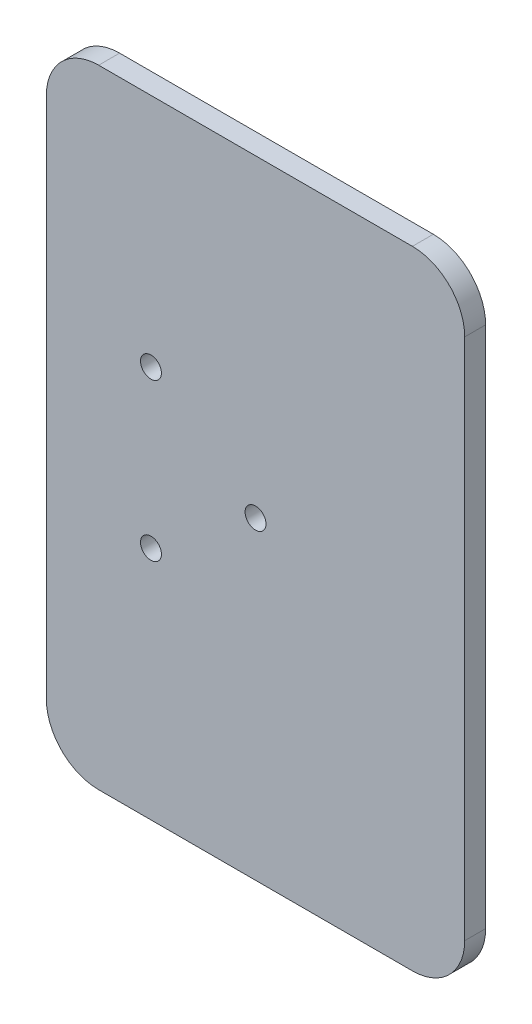
ISO-10303-21;
HEADER;
FILE_DESCRIPTION(('STEP AP214'),'2;1');
FILE_NAME('part.step','',(''),(''),'','','');
FILE_SCHEMA(('AUTOMOTIVE_DESIGN { 1 0 10303 214 1 1 1 1 }'));
ENDSEC;
DATA;
#1=APPLICATION_CONTEXT('core data for automotive mechanical design processes');
#2=APPLICATION_PROTOCOL_DEFINITION('international standard','automotive_design',2000,#1);
#3=PRODUCT_CONTEXT('',#1,'mechanical');
#4=PRODUCT('Part','Part','',(#3));
#5=PRODUCT_RELATED_PRODUCT_CATEGORY('part','',(#4));
#6=PRODUCT_DEFINITION_FORMATION('','',#4);
#7=PRODUCT_DEFINITION_CONTEXT('part definition',#1,'design');
#8=PRODUCT_DEFINITION('design','',#6,#7);
#9=PRODUCT_DEFINITION_SHAPE('','',#8);
#10=(LENGTH_UNIT() NAMED_UNIT(*) SI_UNIT(.MILLI.,.METRE.));
#11=(NAMED_UNIT(*) PLANE_ANGLE_UNIT() SI_UNIT($,.RADIAN.));
#12=(NAMED_UNIT(*) SI_UNIT($,.STERADIAN.) SOLID_ANGLE_UNIT());
#13=UNCERTAINTY_MEASURE_WITH_UNIT(LENGTH_MEASURE(1.E-05),#10,'distance_accuracy_value','');
#14=(GEOMETRIC_REPRESENTATION_CONTEXT(3) GLOBAL_UNCERTAINTY_ASSIGNED_CONTEXT((#13)) GLOBAL_UNIT_ASSIGNED_CONTEXT((#10,
#11,#12)) REPRESENTATION_CONTEXT('',''));
#15=CARTESIAN_POINT('',(0.,0.,0.));
#16=DIRECTION('',(0.,0.,1.));
#17=DIRECTION('',(1.,0.,0.));
#18=AXIS2_PLACEMENT_3D('',#15,#16,#17);
#19=CARTESIAN_POINT('',(-65.9850692997892,26.8064344030394,-2.));
#20=DIRECTION('',(0.,-1.,0.));
#21=DIRECTION('',(0.,0.,-1.));
#22=AXIS2_PLACEMENT_3D('',#19,#20,#21);
#23=PLANE('',#22);
#24=DIRECTION('',(1.,0.,0.));
#25=VECTOR('',#24,1.);
#26=CARTESIAN_POINT('',(-65.9850692997892,26.8064344030394,0.));
#27=LINE('',#26,#25);
#28=CARTESIAN_POINT('',(-60.9850692997892,26.8064344030394,0.));
#29=VERTEX_POINT('',#28);
#30=CARTESIAN_POINT('',(-30.9850692997892,26.8064344030394,0.));
#31=VERTEX_POINT('',#30);
#32=EDGE_CURVE('E148',#29,#31,#27,.T.);
#33=ORIENTED_EDGE('',*,*,#32,.T.);
#34=DIRECTION('',(0.,0.,1.));
#35=VECTOR('',#34,1.);
#36=CARTESIAN_POINT('',(-30.9850692997892,26.8064344030394,-2.));
#37=LINE('',#36,#35);
#38=CARTESIAN_POINT('',(-30.9850692997892,26.8064344030394,-2.));
#39=VERTEX_POINT('',#38);
#40=EDGE_CURVE('E123',#31,#39,#37,.F.);
#41=ORIENTED_EDGE('',*,*,#40,.T.);
#42=DIRECTION('',(1.,0.,0.));
#43=VECTOR('',#42,1.);
#44=CARTESIAN_POINT('',(-65.9850692997892,26.8064344030394,-2.));
#45=LINE('',#44,#43);
#46=CARTESIAN_POINT('',(-60.9850692997892,26.8064344030394,-2.));
#47=VERTEX_POINT('',#46);
#48=EDGE_CURVE('E161',#47,#39,#45,.T.);
#49=ORIENTED_EDGE('',*,*,#48,.F.);
#50=DIRECTION('',(0.,0.,1.));
#51=VECTOR('',#50,1.);
#52=CARTESIAN_POINT('',(-60.9850692997892,26.8064344030394,0.));
#53=LINE('',#52,#51);
#54=EDGE_CURVE('E129',#47,#29,#53,.T.);
#55=ORIENTED_EDGE('',*,*,#54,.T.);
#56=EDGE_LOOP('',(#33,#41,#49,#55));
#57=FACE_BOUND('',#56,.T.);
#58=ADVANCED_FACE('F49',(#57),#23,.F.);
#59=CARTESIAN_POINT('',(-25.9850692997892,26.8064344030394,-2.));
#60=DIRECTION('',(-1.,0.,0.));
#61=DIRECTION('',(0.,-1.,0.));
#62=AXIS2_PLACEMENT_3D('',#59,#60,#61);
#63=PLANE('',#62);
#64=DIRECTION('',(0.,-1.,0.));
#65=VECTOR('',#64,1.);
#66=CARTESIAN_POINT('',(-25.9850692997892,26.8064344030394,-2.));
#67=LINE('',#66,#65);
#68=CARTESIAN_POINT('',(-25.9850692997892,21.8064344030394,-2.));
#69=VERTEX_POINT('',#68);
#70=CARTESIAN_POINT('',(-25.9850692997892,-28.1935655969606,-2.));
#71=VERTEX_POINT('',#70);
#72=EDGE_CURVE('E139',#69,#71,#67,.T.);
#73=ORIENTED_EDGE('',*,*,#72,.F.);
#74=DIRECTION('',(0.,0.,1.));
#75=VECTOR('',#74,1.);
#76=CARTESIAN_POINT('',(-25.9850692997892,21.8064344030394,-2.));
#77=LINE('',#76,#75);
#78=CARTESIAN_POINT('',(-25.9850692997892,21.8064344030394,0.));
#79=VERTEX_POINT('',#78);
#80=EDGE_CURVE('E122',#69,#79,#77,.T.);
#81=ORIENTED_EDGE('',*,*,#80,.T.);
#82=DIRECTION('',(0.,-1.,0.));
#83=VECTOR('',#82,1.);
#84=CARTESIAN_POINT('',(-25.9850692997892,26.8064344030394,0.));
#85=LINE('',#84,#83);
#86=CARTESIAN_POINT('',(-25.9850692997892,-28.1935655969606,0.));
#87=VERTEX_POINT('',#86);
#88=EDGE_CURVE('E136',#79,#87,#85,.T.);
#89=ORIENTED_EDGE('',*,*,#88,.T.);
#90=DIRECTION('',(0.,0.,1.));
#91=VECTOR('',#90,1.);
#92=CARTESIAN_POINT('',(-25.9850692997892,-28.1935655969606,-2.));
#93=LINE('',#92,#91);
#94=EDGE_CURVE('E142',#87,#71,#93,.F.);
#95=ORIENTED_EDGE('',*,*,#94,.T.);
#96=EDGE_LOOP('',(#73,#81,#89,#95));
#97=FACE_BOUND('',#96,.T.);
#98=ADVANCED_FACE('F135',(#97),#63,.F.);
#99=CARTESIAN_POINT('',(-65.9850692997892,-33.1935655969606,-2.));
#100=DIRECTION('',(0.,-1.,0.));
#101=DIRECTION('',(0.,0.,-1.));
#102=AXIS2_PLACEMENT_3D('',#99,#100,#101);
#103=PLANE('',#102);
#104=DIRECTION('',(1.,0.,0.));
#105=VECTOR('',#104,1.);
#106=CARTESIAN_POINT('',(-65.9850692997892,-33.1935655969606,-2.));
#107=LINE('',#106,#105);
#108=CARTESIAN_POINT('',(-60.9850692997892,-33.1935655969606,-2.));
#109=VERTEX_POINT('',#108);
#110=CARTESIAN_POINT('',(-30.9850692997892,-33.1935655969606,-2.));
#111=VERTEX_POINT('',#110);
#112=EDGE_CURVE('E226',#109,#111,#107,.T.);
#113=ORIENTED_EDGE('',*,*,#112,.T.);
#114=DIRECTION('',(0.,0.,1.));
#115=VECTOR('',#114,1.);
#116=CARTESIAN_POINT('',(-30.9850692997892,-33.1935655969606,0.));
#117=LINE('',#116,#115);
#118=CARTESIAN_POINT('',(-30.9850692997892,-33.1935655969606,0.));
#119=VERTEX_POINT('',#118);
#120=EDGE_CURVE('E191',#111,#119,#117,.T.);
#121=ORIENTED_EDGE('',*,*,#120,.T.);
#122=DIRECTION('',(1.,0.,0.));
#123=VECTOR('',#122,1.);
#124=CARTESIAN_POINT('',(-65.9850692997892,-33.1935655969606,0.));
#125=LINE('',#124,#123);
#126=CARTESIAN_POINT('',(-60.9850692997892,-33.1935655969606,0.));
#127=VERTEX_POINT('',#126);
#128=EDGE_CURVE('E147',#127,#119,#125,.T.);
#129=ORIENTED_EDGE('',*,*,#128,.F.);
#130=DIRECTION('',(0.,0.,1.));
#131=VECTOR('',#130,1.);
#132=CARTESIAN_POINT('',(-60.9850692997892,-33.1935655969606,-2.));
#133=LINE('',#132,#131);
#134=EDGE_CURVE('E188',#127,#109,#133,.F.);
#135=ORIENTED_EDGE('',*,*,#134,.T.);
#136=EDGE_LOOP('',(#113,#121,#129,#135));
#137=FACE_BOUND('',#136,.T.);
#138=ADVANCED_FACE('F238',(#137),#103,.T.);
#139=CARTESIAN_POINT('',(-65.9850692997892,26.8064344030394,-2.));
#140=DIRECTION('',(-1.,0.,0.));
#141=DIRECTION('',(0.,-1.,0.));
#142=AXIS2_PLACEMENT_3D('',#139,#140,#141);
#143=PLANE('',#142);
#144=DIRECTION('',(0.,-1.,0.));
#145=VECTOR('',#144,1.);
#146=CARTESIAN_POINT('',(-65.9850692997892,26.8064344030394,-2.));
#147=LINE('',#146,#145);
#148=CARTESIAN_POINT('',(-65.9850692997892,21.8064344030394,-2.));
#149=VERTEX_POINT('',#148);
#150=CARTESIAN_POINT('',(-65.9850692997892,-28.1935655969606,-2.));
#151=VERTEX_POINT('',#150);
#152=EDGE_CURVE('E163',#149,#151,#147,.T.);
#153=ORIENTED_EDGE('',*,*,#152,.T.);
#154=DIRECTION('',(0.,0.,1.));
#155=VECTOR('',#154,1.);
#156=CARTESIAN_POINT('',(-65.9850692997892,-28.1935655969606,-2.));
#157=LINE('',#156,#155);
#158=CARTESIAN_POINT('',(-65.9850692997892,-28.1935655969606,0.));
#159=VERTEX_POINT('',#158);
#160=EDGE_CURVE('E11',#151,#159,#157,.T.);
#161=ORIENTED_EDGE('',*,*,#160,.T.);
#162=DIRECTION('',(0.,-1.,0.));
#163=VECTOR('',#162,1.);
#164=CARTESIAN_POINT('',(-65.9850692997892,26.8064344030394,0.));
#165=LINE('',#164,#163);
#166=CARTESIAN_POINT('',(-65.9850692997892,21.8064344030394,0.));
#167=VERTEX_POINT('',#166);
#168=EDGE_CURVE('E152',#167,#159,#165,.T.);
#169=ORIENTED_EDGE('',*,*,#168,.F.);
#170=DIRECTION('',(0.,0.,1.));
#171=VECTOR('',#170,1.);
#172=CARTESIAN_POINT('',(-65.9850692997892,21.8064344030394,-2.));
#173=LINE('',#172,#171);
#174=EDGE_CURVE('E59',#167,#149,#173,.F.);
#175=ORIENTED_EDGE('',*,*,#174,.T.);
#176=EDGE_LOOP('',(#153,#161,#169,#175));
#177=FACE_BOUND('',#176,.T.);
#178=ADVANCED_FACE('F231',(#177),#143,.T.);
#179=CARTESIAN_POINT('',(0.,0.,-2.));
#180=DIRECTION('',(0.,0.,-1.));
#181=DIRECTION('',(-1.,0.,0.));
#182=AXIS2_PLACEMENT_3D('',#179,#180,#181);
#183=PLANE('',#182);
#184=CARTESIAN_POINT('',(-55.9850692997892,4.30643440303937,-2.));
#185=DIRECTION('',(0.,0.,-1.));
#186=DIRECTION('',(-1.,0.,0.));
#187=AXIS2_PLACEMENT_3D('',#184,#185,#186);
#188=CIRCLE('',#187,0.999999999999998);
#189=CARTESIAN_POINT('',(-56.9850692997892,4.30643440303937,-2.));
#190=VERTEX_POINT('',#189);
#191=EDGE_CURVE('E213',#190,#190,#188,.F.);
#192=ORIENTED_EDGE('',*,*,#191,.T.);
#193=EDGE_LOOP('',(#192));
#194=FACE_BOUND('',#193,.T.);
#195=CARTESIAN_POINT('',(-55.9850692997892,-10.6935655969606,-2.));
#196=DIRECTION('',(0.,0.,-1.));
#197=DIRECTION('',(-1.,0.,0.));
#198=AXIS2_PLACEMENT_3D('',#195,#196,#197);
#199=CIRCLE('',#198,0.999999999999998);
#200=CARTESIAN_POINT('',(-56.9850692997892,-10.6935655969606,-2.));
#201=VERTEX_POINT('',#200);
#202=EDGE_CURVE('E203',#201,#201,#199,.F.);
#203=ORIENTED_EDGE('',*,*,#202,.T.);
#204=EDGE_LOOP('',(#203));
#205=FACE_BOUND('',#204,.T.);
#206=CARTESIAN_POINT('',(-45.9850692997892,-3.19356559696063,-2.));
#207=DIRECTION('',(0.,0.,-1.));
#208=DIRECTION('',(-1.,0.,0.));
#209=AXIS2_PLACEMENT_3D('',#206,#207,#208);
#210=CIRCLE('',#209,0.999999999999998);
#211=CARTESIAN_POINT('',(-46.9850692997892,-3.19356559696063,-2.));
#212=VERTEX_POINT('',#211);
#213=EDGE_CURVE('E199',#212,#212,#210,.T.);
#214=ORIENTED_EDGE('',*,*,#213,.F.);
#215=EDGE_LOOP('',(#214));
#216=FACE_BOUND('',#215,.T.);
#217=ORIENTED_EDGE('',*,*,#48,.T.);
#218=CARTESIAN_POINT('',(-30.9850692997892,21.8064344030394,-2.));
#219=DIRECTION('',(0.,0.,-1.));
#220=DIRECTION('',(-1.,0.,0.));
#221=AXIS2_PLACEMENT_3D('',#218,#219,#220);
#222=CIRCLE('',#221,5.);
#223=EDGE_CURVE('E185',#39,#69,#222,.T.);
#224=ORIENTED_EDGE('',*,*,#223,.T.);
#225=ORIENTED_EDGE('',*,*,#72,.T.);
#226=CARTESIAN_POINT('',(-30.9850692997892,-28.1935655969606,-2.));
#227=DIRECTION('',(0.,0.,-1.));
#228=DIRECTION('',(-1.,0.,0.));
#229=AXIS2_PLACEMENT_3D('',#226,#227,#228);
#230=CIRCLE('',#229,5.);
#231=EDGE_CURVE('E182',#71,#111,#230,.T.);
#232=ORIENTED_EDGE('',*,*,#231,.T.);
#233=ORIENTED_EDGE('',*,*,#112,.F.);
#234=CARTESIAN_POINT('',(-60.9850692997892,-28.1935655969606,-2.));
#235=DIRECTION('',(0.,0.,-1.));
#236=DIRECTION('',(-1.,0.,0.));
#237=AXIS2_PLACEMENT_3D('',#234,#235,#236);
#238=CIRCLE('',#237,5.);
#239=EDGE_CURVE('E67',#109,#151,#238,.T.);
#240=ORIENTED_EDGE('',*,*,#239,.T.);
#241=ORIENTED_EDGE('',*,*,#152,.F.);
#242=CARTESIAN_POINT('',(-60.9850692997892,21.8064344030394,-2.));
#243=DIRECTION('',(0.,0.,-1.));
#244=DIRECTION('',(-1.,0.,0.));
#245=AXIS2_PLACEMENT_3D('',#242,#243,#244);
#246=CIRCLE('',#245,5.);
#247=EDGE_CURVE('E177',#149,#47,#246,.T.);
#248=ORIENTED_EDGE('',*,*,#247,.T.);
#249=EDGE_LOOP('',(#217,#224,#225,#232,#233,#240,#241,#248));
#250=FACE_BOUND('',#249,.T.);
#251=ADVANCED_FACE('F243',(#194,#205,#216,#250),#183,.T.);
#252=CARTESIAN_POINT('',(0.,0.,0.));
#253=DIRECTION('',(0.,0.,-1.));
#254=DIRECTION('',(-1.,0.,0.));
#255=AXIS2_PLACEMENT_3D('',#252,#253,#254);
#256=PLANE('',#255);
#257=CARTESIAN_POINT('',(-55.9850692997892,4.30643440303937,0.));
#258=DIRECTION('',(0.,0.,-1.));
#259=DIRECTION('',(-1.,0.,0.));
#260=AXIS2_PLACEMENT_3D('',#257,#258,#259);
#261=CIRCLE('',#260,0.999999999999998);
#262=CARTESIAN_POINT('',(-56.9850692997892,4.30643440303937,0.));
#263=VERTEX_POINT('',#262);
#264=EDGE_CURVE('E53',#263,#263,#261,.F.);
#265=ORIENTED_EDGE('',*,*,#264,.F.);
#266=EDGE_LOOP('',(#265));
#267=FACE_BOUND('',#266,.T.);
#268=CARTESIAN_POINT('',(-55.9850692997892,-10.6935655969606,0.));
#269=DIRECTION('',(0.,0.,-1.));
#270=DIRECTION('',(-1.,0.,0.));
#271=AXIS2_PLACEMENT_3D('',#268,#269,#270);
#272=CIRCLE('',#271,0.999999999999998);
#273=CARTESIAN_POINT('',(-56.9850692997892,-10.6935655969606,0.));
#274=VERTEX_POINT('',#273);
#275=EDGE_CURVE('E200',#274,#274,#272,.F.);
#276=ORIENTED_EDGE('',*,*,#275,.F.);
#277=EDGE_LOOP('',(#276));
#278=FACE_BOUND('',#277,.T.);
#279=CARTESIAN_POINT('',(-45.9850692997892,-3.19356559696063,0.));
#280=DIRECTION('',(0.,0.,-1.));
#281=DIRECTION('',(-1.,0.,0.));
#282=AXIS2_PLACEMENT_3D('',#279,#280,#281);
#283=CIRCLE('',#282,0.999999999999998);
#284=CARTESIAN_POINT('',(-46.9850692997892,-3.19356559696063,0.));
#285=VERTEX_POINT('',#284);
#286=EDGE_CURVE('E154',#285,#285,#283,.T.);
#287=ORIENTED_EDGE('',*,*,#286,.T.);
#288=EDGE_LOOP('',(#287));
#289=FACE_BOUND('',#288,.T.);
#290=ORIENTED_EDGE('',*,*,#88,.F.);
#291=CARTESIAN_POINT('',(-30.9850692997892,21.8064344030394,0.));
#292=DIRECTION('',(0.,0.,-1.));
#293=DIRECTION('',(-1.,0.,0.));
#294=AXIS2_PLACEMENT_3D('',#291,#292,#293);
#295=CIRCLE('',#294,5.);
#296=EDGE_CURVE('E118',#79,#31,#295,.F.);
#297=ORIENTED_EDGE('',*,*,#296,.T.);
#298=ORIENTED_EDGE('',*,*,#32,.F.);
#299=CARTESIAN_POINT('',(-60.9850692997892,21.8064344030394,0.));
#300=DIRECTION('',(0.,0.,-1.));
#301=DIRECTION('',(-1.,0.,0.));
#302=AXIS2_PLACEMENT_3D('',#299,#300,#301);
#303=CIRCLE('',#302,5.);
#304=EDGE_CURVE('E141',#29,#167,#303,.F.);
#305=ORIENTED_EDGE('',*,*,#304,.T.);
#306=ORIENTED_EDGE('',*,*,#168,.T.);
#307=CARTESIAN_POINT('',(-60.9850692997892,-28.1935655969606,0.));
#308=DIRECTION('',(0.,0.,-1.));
#309=DIRECTION('',(-1.,0.,0.));
#310=AXIS2_PLACEMENT_3D('',#307,#308,#309);
#311=CIRCLE('',#310,5.);
#312=EDGE_CURVE('E167',#159,#127,#311,.F.);
#313=ORIENTED_EDGE('',*,*,#312,.T.);
#314=ORIENTED_EDGE('',*,*,#128,.T.);
#315=CARTESIAN_POINT('',(-30.9850692997892,-28.1935655969606,0.));
#316=DIRECTION('',(0.,0.,-1.));
#317=DIRECTION('',(-1.,0.,0.));
#318=AXIS2_PLACEMENT_3D('',#315,#316,#317);
#319=CIRCLE('',#318,5.);
#320=EDGE_CURVE('E130',#119,#87,#319,.F.);
#321=ORIENTED_EDGE('',*,*,#320,.T.);
#322=EDGE_LOOP('',(#290,#297,#298,#305,#306,#313,#314,#321));
#323=FACE_BOUND('',#322,.T.);
#324=ADVANCED_FACE('F144',(#267,#278,#289,#323),#256,.F.);
#325=CARTESIAN_POINT('',(-30.9850692997892,21.8064344030394,-2.));
#326=DIRECTION('',(0.,0.,1.));
#327=DIRECTION('',(1.,0.,0.));
#328=AXIS2_PLACEMENT_3D('',#325,#326,#327);
#329=CYLINDRICAL_SURFACE('',#328,5.);
#330=ORIENTED_EDGE('',*,*,#223,.F.);
#331=ORIENTED_EDGE('',*,*,#40,.F.);
#332=ORIENTED_EDGE('',*,*,#296,.F.);
#333=ORIENTED_EDGE('',*,*,#80,.F.);
#334=EDGE_LOOP('',(#330,#331,#332,#333));
#335=FACE_BOUND('',#334,.T.);
#336=ADVANCED_FACE('F121',(#335),#329,.T.);
#337=CARTESIAN_POINT('',(-30.9850692997892,-28.1935655969606,-2.));
#338=DIRECTION('',(0.,0.,-1.));
#339=DIRECTION('',(-1.,0.,0.));
#340=AXIS2_PLACEMENT_3D('',#337,#338,#339);
#341=CYLINDRICAL_SURFACE('',#340,5.);
#342=ORIENTED_EDGE('',*,*,#231,.F.);
#343=ORIENTED_EDGE('',*,*,#94,.F.);
#344=ORIENTED_EDGE('',*,*,#320,.F.);
#345=ORIENTED_EDGE('',*,*,#120,.F.);
#346=EDGE_LOOP('',(#342,#343,#344,#345));
#347=FACE_BOUND('',#346,.T.);
#348=ADVANCED_FACE('F242',(#347),#341,.T.);
#349=CARTESIAN_POINT('',(-60.9850692997892,-28.1935655969606,-2.));
#350=DIRECTION('',(0.,0.,1.));
#351=DIRECTION('',(1.,0.,0.));
#352=AXIS2_PLACEMENT_3D('',#349,#350,#351);
#353=CYLINDRICAL_SURFACE('',#352,5.);
#354=ORIENTED_EDGE('',*,*,#239,.F.);
#355=ORIENTED_EDGE('',*,*,#134,.F.);
#356=ORIENTED_EDGE('',*,*,#312,.F.);
#357=ORIENTED_EDGE('',*,*,#160,.F.);
#358=EDGE_LOOP('',(#354,#355,#356,#357));
#359=FACE_BOUND('',#358,.T.);
#360=ADVANCED_FACE('F234',(#359),#353,.T.);
#361=CARTESIAN_POINT('',(-60.9850692997892,21.8064344030394,-2.));
#362=DIRECTION('',(0.,0.,-1.));
#363=DIRECTION('',(-1.,0.,0.));
#364=AXIS2_PLACEMENT_3D('',#361,#362,#363);
#365=CYLINDRICAL_SURFACE('',#364,5.);
#366=ORIENTED_EDGE('',*,*,#247,.F.);
#367=ORIENTED_EDGE('',*,*,#174,.F.);
#368=ORIENTED_EDGE('',*,*,#304,.F.);
#369=ORIENTED_EDGE('',*,*,#54,.F.);
#370=EDGE_LOOP('',(#366,#367,#368,#369));
#371=FACE_BOUND('',#370,.T.);
#372=ADVANCED_FACE('F51',(#371),#365,.T.);
#373=CARTESIAN_POINT('',(-45.9850692997892,-3.19356559696063,10.));
#374=DIRECTION('',(0.,0.,-1.));
#375=DIRECTION('',(-1.,0.,0.));
#376=AXIS2_PLACEMENT_3D('',#373,#374,#375);
#377=CYLINDRICAL_SURFACE('',#376,0.999999999999998);
#378=ORIENTED_EDGE('',*,*,#213,.T.);
#379=EDGE_LOOP('',(#378));
#380=FACE_BOUND('',#379,.T.);
#381=ORIENTED_EDGE('',*,*,#286,.F.);
#382=EDGE_LOOP('',(#381));
#383=FACE_BOUND('',#382,.T.);
#384=ADVANCED_FACE('F249',(#380,#383),#377,.F.);
#385=CARTESIAN_POINT('',(-55.9850692997892,-10.6935655969606,-10.));
#386=DIRECTION('',(0.,0.,1.));
#387=DIRECTION('',(1.,0.,0.));
#388=AXIS2_PLACEMENT_3D('',#385,#386,#387);
#389=CYLINDRICAL_SURFACE('',#388,0.999999999999998);
#390=ORIENTED_EDGE('',*,*,#202,.F.);
#391=EDGE_LOOP('',(#390));
#392=FACE_BOUND('',#391,.T.);
#393=ORIENTED_EDGE('',*,*,#275,.T.);
#394=EDGE_LOOP('',(#393));
#395=FACE_BOUND('',#394,.T.);
#396=ADVANCED_FACE('F255',(#392,#395),#389,.F.);
#397=CARTESIAN_POINT('',(-55.9850692997892,4.30643440303937,-10.));
#398=DIRECTION('',(0.,0.,1.));
#399=DIRECTION('',(1.,0.,0.));
#400=AXIS2_PLACEMENT_3D('',#397,#398,#399);
#401=CYLINDRICAL_SURFACE('',#400,0.999999999999998);
#402=ORIENTED_EDGE('',*,*,#191,.F.);
#403=EDGE_LOOP('',(#402));
#404=FACE_BOUND('',#403,.T.);
#405=ORIENTED_EDGE('',*,*,#264,.T.);
#406=EDGE_LOOP('',(#405));
#407=FACE_BOUND('',#406,.T.);
#408=ADVANCED_FACE('F359',(#404,#407),#401,.F.);
#409=CLOSED_SHELL('',(#58,#98,#138,#178,#251,#324,#336,#348,#360,#372,#384,#396,#408));
#410=MANIFOLD_SOLID_BREP('B2',#409);
#411=ADVANCED_BREP_SHAPE_REPRESENTATION('',(#18,#410),#14);
#412=SHAPE_DEFINITION_REPRESENTATION(#9,#411);
ENDSEC;
END-ISO-10303-21;
